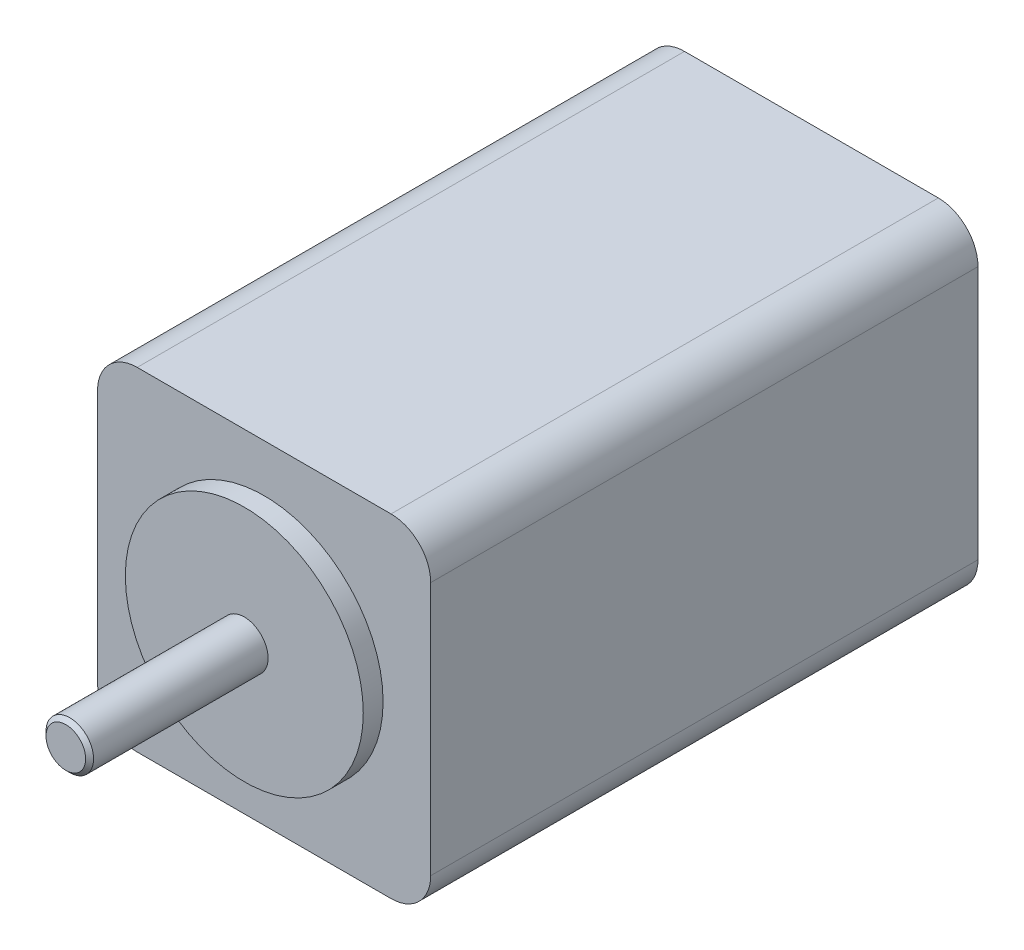
ISO-10303-21;
HEADER;
FILE_DESCRIPTION(('STEP AP214'),'2;1');
FILE_NAME('part.step','',(''),(''),'','','');
FILE_SCHEMA(('AUTOMOTIVE_DESIGN { 1 0 10303 214 1 1 1 1 }'));
ENDSEC;
DATA;
#1=APPLICATION_CONTEXT('core data for automotive mechanical design processes');
#2=APPLICATION_PROTOCOL_DEFINITION('international standard','automotive_design',2000,#1);
#3=PRODUCT_CONTEXT('',#1,'mechanical');
#4=PRODUCT('Part','Part','',(#3));
#5=PRODUCT_RELATED_PRODUCT_CATEGORY('part','',(#4));
#6=PRODUCT_DEFINITION_FORMATION('','',#4);
#7=PRODUCT_DEFINITION_CONTEXT('part definition',#1,'design');
#8=PRODUCT_DEFINITION('design','',#6,#7);
#9=PRODUCT_DEFINITION_SHAPE('','',#8);
#10=(LENGTH_UNIT() NAMED_UNIT(*) SI_UNIT(.MILLI.,.METRE.));
#11=(NAMED_UNIT(*) PLANE_ANGLE_UNIT() SI_UNIT($,.RADIAN.));
#12=(NAMED_UNIT(*) SI_UNIT($,.STERADIAN.) SOLID_ANGLE_UNIT());
#13=UNCERTAINTY_MEASURE_WITH_UNIT(LENGTH_MEASURE(1.E-05),#10,'distance_accuracy_value','');
#14=(GEOMETRIC_REPRESENTATION_CONTEXT(3) GLOBAL_UNCERTAINTY_ASSIGNED_CONTEXT((#13)) GLOBAL_UNIT_ASSIGNED_CONTEXT((#10,
#11,#12)) REPRESENTATION_CONTEXT('',''));
#15=CARTESIAN_POINT('',(0.,0.,0.));
#16=DIRECTION('',(0.,0.,1.));
#17=DIRECTION('',(1.,0.,0.));
#18=AXIS2_PLACEMENT_3D('',#15,#16,#17);
#19=CARTESIAN_POINT('',(0.,0.,7.5));
#20=DIRECTION('',(0.,0.,1.));
#21=DIRECTION('',(1.,0.,0.));
#22=AXIS2_PLACEMENT_3D('',#19,#20,#21);
#23=PLANE('',#22);
#24=CARTESIAN_POINT('',(0.,0.,7.5));
#25=DIRECTION('',(0.,0.,1.));
#26=DIRECTION('',(1.,0.,0.));
#27=AXIS2_PLACEMENT_3D('',#24,#25,#26);
#28=CIRCLE('',#27,15.);
#29=CARTESIAN_POINT('',(15.,0.,7.5));
#30=VERTEX_POINT('',#29);
#31=EDGE_CURVE('E147',#30,#30,#28,.T.);
#32=ORIENTED_EDGE('',*,*,#31,.T.);
#33=EDGE_LOOP('',(#32));
#34=FACE_BOUND('',#33,.T.);
#35=CARTESIAN_POINT('',(0.,0.,7.5));
#36=DIRECTION('',(0.,0.,1.));
#37=DIRECTION('',(1.,0.,0.));
#38=AXIS2_PLACEMENT_3D('',#35,#36,#37);
#39=CIRCLE('',#38,3.);
#40=CARTESIAN_POINT('',(-3.,0.,7.5));
#41=VERTEX_POINT('',#40);
#42=EDGE_CURVE('E143',#41,#41,#39,.T.);
#43=ORIENTED_EDGE('',*,*,#42,.F.);
#44=EDGE_LOOP('',(#43));
#45=FACE_BOUND('',#44,.T.);
#46=ADVANCED_FACE('F35',(#34,#45),#23,.T.);
#47=CARTESIAN_POINT('',(0.,0.,5.));
#48=DIRECTION('',(0.,0.,1.));
#49=DIRECTION('',(1.,0.,0.));
#50=AXIS2_PLACEMENT_3D('',#47,#48,#49);
#51=PLANE('',#50);
#52=DIRECTION('',(1.,0.,0.));
#53=VECTOR('',#52,1.);
#54=CARTESIAN_POINT('',(-21.,-21.,5.));
#55=LINE('',#54,#53);
#56=CARTESIAN_POINT('',(-16.,-21.,5.));
#57=VERTEX_POINT('',#56);
#58=CARTESIAN_POINT('',(16.,-21.,5.));
#59=VERTEX_POINT('',#58);
#60=EDGE_CURVE('E159',#57,#59,#55,.T.);
#61=ORIENTED_EDGE('',*,*,#60,.T.);
#62=CARTESIAN_POINT('',(16.,-16.,5.));
#63=DIRECTION('',(0.,0.,1.));
#64=DIRECTION('',(1.,0.,0.));
#65=AXIS2_PLACEMENT_3D('',#62,#63,#64);
#66=CIRCLE('',#65,5.);
#67=CARTESIAN_POINT('',(21.,-16.,5.));
#68=VERTEX_POINT('',#67);
#69=EDGE_CURVE('E107',#59,#68,#66,.T.);
#70=ORIENTED_EDGE('',*,*,#69,.T.);
#71=DIRECTION('',(0.,1.,0.));
#72=VECTOR('',#71,1.);
#73=CARTESIAN_POINT('',(21.,21.,5.));
#74=LINE('',#73,#72);
#75=CARTESIAN_POINT('',(21.,16.,5.));
#76=VERTEX_POINT('',#75);
#77=EDGE_CURVE('E150',#68,#76,#74,.T.);
#78=ORIENTED_EDGE('',*,*,#77,.T.);
#79=CARTESIAN_POINT('',(16.,16.,5.));
#80=DIRECTION('',(0.,0.,1.));
#81=DIRECTION('',(1.,0.,0.));
#82=AXIS2_PLACEMENT_3D('',#79,#80,#81);
#83=CIRCLE('',#82,5.);
#84=CARTESIAN_POINT('',(16.,21.,5.));
#85=VERTEX_POINT('',#84);
#86=EDGE_CURVE('E111',#76,#85,#83,.T.);
#87=ORIENTED_EDGE('',*,*,#86,.T.);
#88=DIRECTION('',(-1.,0.,0.));
#89=VECTOR('',#88,1.);
#90=CARTESIAN_POINT('',(-21.,21.,5.));
#91=LINE('',#90,#89);
#92=CARTESIAN_POINT('',(-16.,21.,5.));
#93=VERTEX_POINT('',#92);
#94=EDGE_CURVE('E155',#85,#93,#91,.T.);
#95=ORIENTED_EDGE('',*,*,#94,.T.);
#96=CARTESIAN_POINT('',(-16.,16.,5.));
#97=DIRECTION('',(0.,0.,1.));
#98=DIRECTION('',(1.,0.,0.));
#99=AXIS2_PLACEMENT_3D('',#96,#97,#98);
#100=CIRCLE('',#99,5.);
#101=CARTESIAN_POINT('',(-21.,16.,5.));
#102=VERTEX_POINT('',#101);
#103=EDGE_CURVE('E57',#93,#102,#100,.T.);
#104=ORIENTED_EDGE('',*,*,#103,.T.);
#105=DIRECTION('',(0.,-1.,0.));
#106=VECTOR('',#105,1.);
#107=CARTESIAN_POINT('',(-21.,21.,5.));
#108=LINE('',#107,#106);
#109=CARTESIAN_POINT('',(-21.,-16.,5.));
#110=VERTEX_POINT('',#109);
#111=EDGE_CURVE('E157',#102,#110,#108,.T.);
#112=ORIENTED_EDGE('',*,*,#111,.T.);
#113=CARTESIAN_POINT('',(-16.,-16.,5.));
#114=DIRECTION('',(0.,0.,1.));
#115=DIRECTION('',(1.,0.,0.));
#116=AXIS2_PLACEMENT_3D('',#113,#114,#115);
#117=CIRCLE('',#116,5.);
#118=EDGE_CURVE('E168',#110,#57,#117,.T.);
#119=ORIENTED_EDGE('',*,*,#118,.T.);
#120=EDGE_LOOP('',(#61,#70,#78,#87,#95,#104,#112,#119));
#121=FACE_BOUND('',#120,.T.);
#122=CARTESIAN_POINT('',(0.,0.,5.));
#123=DIRECTION('',(0.,0.,1.));
#124=DIRECTION('',(1.,0.,0.));
#125=AXIS2_PLACEMENT_3D('',#122,#123,#124);
#126=CIRCLE('',#125,15.);
#127=CARTESIAN_POINT('',(15.,0.,5.));
#128=VERTEX_POINT('',#127);
#129=EDGE_CURVE('E146',#128,#128,#126,.T.);
#130=ORIENTED_EDGE('',*,*,#129,.F.);
#131=EDGE_LOOP('',(#130));
#132=FACE_BOUND('',#131,.T.);
#133=ADVANCED_FACE('F190',(#121,#132),#51,.T.);
#134=CARTESIAN_POINT('',(21.,21.,5.));
#135=DIRECTION('',(-1.,0.,0.));
#136=DIRECTION('',(0.,-1.,0.));
#137=AXIS2_PLACEMENT_3D('',#134,#135,#136);
#138=PLANE('',#137);
#139=ORIENTED_EDGE('',*,*,#77,.F.);
#140=DIRECTION('',(0.,0.,-1.));
#141=VECTOR('',#140,1.);
#142=CARTESIAN_POINT('',(21.,-16.,5.));
#143=LINE('',#142,#141);
#144=CARTESIAN_POINT('',(21.,-16.,-64.));
#145=VERTEX_POINT('',#144);
#146=EDGE_CURVE('E163',#68,#145,#143,.T.);
#147=ORIENTED_EDGE('',*,*,#146,.T.);
#148=DIRECTION('',(0.,-1.,0.));
#149=VECTOR('',#148,1.);
#150=CARTESIAN_POINT('',(21.,-16.,-64.));
#151=LINE('',#150,#149);
#152=CARTESIAN_POINT('',(21.,16.,-64.));
#153=VERTEX_POINT('',#152);
#154=EDGE_CURVE('E127',#153,#145,#151,.T.);
#155=ORIENTED_EDGE('',*,*,#154,.F.);
#156=DIRECTION('',(0.,0.,-1.));
#157=VECTOR('',#156,1.);
#158=CARTESIAN_POINT('',(21.,16.,5.));
#159=LINE('',#158,#157);
#160=EDGE_CURVE('E161',#153,#76,#159,.F.);
#161=ORIENTED_EDGE('',*,*,#160,.T.);
#162=EDGE_LOOP('',(#139,#147,#155,#161));
#163=FACE_BOUND('',#162,.T.);
#164=ADVANCED_FACE('F196',(#163),#138,.F.);
#165=CARTESIAN_POINT('',(-21.,21.,5.));
#166=DIRECTION('',(0.,-1.,0.));
#167=DIRECTION('',(0.,0.,-1.));
#168=AXIS2_PLACEMENT_3D('',#165,#166,#167);
#169=PLANE('',#168);
#170=DIRECTION('',(0.,0.,-1.));
#171=VECTOR('',#170,1.);
#172=CARTESIAN_POINT('',(16.,21.,5.));
#173=LINE('',#172,#171);
#174=CARTESIAN_POINT('',(16.,21.,-64.));
#175=VERTEX_POINT('',#174);
#176=EDGE_CURVE('E174',#85,#175,#173,.T.);
#177=ORIENTED_EDGE('',*,*,#176,.T.);
#178=DIRECTION('',(1.,0.,0.));
#179=VECTOR('',#178,1.);
#180=CARTESIAN_POINT('',(16.,21.,-64.));
#181=LINE('',#180,#179);
#182=CARTESIAN_POINT('',(-16.,21.,-64.));
#183=VERTEX_POINT('',#182);
#184=EDGE_CURVE('E137',#183,#175,#181,.T.);
#185=ORIENTED_EDGE('',*,*,#184,.F.);
#186=DIRECTION('',(0.,0.,-1.));
#187=VECTOR('',#186,1.);
#188=CARTESIAN_POINT('',(-16.,21.,5.));
#189=LINE('',#188,#187);
#190=EDGE_CURVE('E176',#183,#93,#189,.F.);
#191=ORIENTED_EDGE('',*,*,#190,.T.);
#192=ORIENTED_EDGE('',*,*,#94,.F.);
#193=EDGE_LOOP('',(#177,#185,#191,#192));
#194=FACE_BOUND('',#193,.T.);
#195=ADVANCED_FACE('F213',(#194),#169,.F.);
#196=CARTESIAN_POINT('',(-21.,21.,5.));
#197=DIRECTION('',(1.,0.,0.));
#198=DIRECTION('',(0.,1.,0.));
#199=AXIS2_PLACEMENT_3D('',#196,#197,#198);
#200=PLANE('',#199);
#201=DIRECTION('',(0.,0.,-1.));
#202=VECTOR('',#201,1.);
#203=CARTESIAN_POINT('',(-21.,16.,5.));
#204=LINE('',#203,#202);
#205=CARTESIAN_POINT('',(-21.,16.,-64.));
#206=VERTEX_POINT('',#205);
#207=EDGE_CURVE('E171',#102,#206,#204,.T.);
#208=ORIENTED_EDGE('',*,*,#207,.T.);
#209=DIRECTION('',(0.,1.,0.));
#210=VECTOR('',#209,1.);
#211=CARTESIAN_POINT('',(-21.,16.,-64.));
#212=LINE('',#211,#210);
#213=CARTESIAN_POINT('',(-21.,-16.,-64.));
#214=VERTEX_POINT('',#213);
#215=EDGE_CURVE('E131',#214,#206,#212,.T.);
#216=ORIENTED_EDGE('',*,*,#215,.F.);
#217=DIRECTION('',(0.,0.,-1.));
#218=VECTOR('',#217,1.);
#219=CARTESIAN_POINT('',(-21.,-16.,5.));
#220=LINE('',#219,#218);
#221=EDGE_CURVE('E50',#214,#110,#220,.F.);
#222=ORIENTED_EDGE('',*,*,#221,.T.);
#223=ORIENTED_EDGE('',*,*,#111,.F.);
#224=EDGE_LOOP('',(#208,#216,#222,#223));
#225=FACE_BOUND('',#224,.T.);
#226=ADVANCED_FACE('F210',(#225),#200,.F.);
#227=CARTESIAN_POINT('',(-21.,-21.,5.));
#228=DIRECTION('',(0.,1.,0.));
#229=DIRECTION('',(0.,0.,1.));
#230=AXIS2_PLACEMENT_3D('',#227,#228,#229);
#231=PLANE('',#230);
#232=DIRECTION('',(0.,0.,-1.));
#233=VECTOR('',#232,1.);
#234=CARTESIAN_POINT('',(-16.,-21.,5.));
#235=LINE('',#234,#233);
#236=CARTESIAN_POINT('',(-16.,-21.,-64.));
#237=VERTEX_POINT('',#236);
#238=EDGE_CURVE('E112',#57,#237,#235,.T.);
#239=ORIENTED_EDGE('',*,*,#238,.T.);
#240=DIRECTION('',(-1.,0.,0.));
#241=VECTOR('',#240,1.);
#242=CARTESIAN_POINT('',(-16.,-21.,-64.));
#243=LINE('',#242,#241);
#244=CARTESIAN_POINT('',(16.,-21.,-64.));
#245=VERTEX_POINT('',#244);
#246=EDGE_CURVE('E115',#245,#237,#243,.T.);
#247=ORIENTED_EDGE('',*,*,#246,.F.);
#248=DIRECTION('',(0.,0.,-1.));
#249=VECTOR('',#248,1.);
#250=CARTESIAN_POINT('',(16.,-21.,5.));
#251=LINE('',#250,#249);
#252=EDGE_CURVE('E101',#245,#59,#251,.F.);
#253=ORIENTED_EDGE('',*,*,#252,.T.);
#254=ORIENTED_EDGE('',*,*,#60,.F.);
#255=EDGE_LOOP('',(#239,#247,#253,#254));
#256=FACE_BOUND('',#255,.T.);
#257=ADVANCED_FACE('F116',(#256),#231,.F.);
#258=CARTESIAN_POINT('',(16.,-16.,5.));
#259=DIRECTION('',(0.,0.,-1.));
#260=DIRECTION('',(-1.,0.,0.));
#261=AXIS2_PLACEMENT_3D('',#258,#259,#260);
#262=CYLINDRICAL_SURFACE('',#261,5.);
#263=ORIENTED_EDGE('',*,*,#69,.F.);
#264=ORIENTED_EDGE('',*,*,#252,.F.);
#265=CARTESIAN_POINT('',(16.,-16.,-64.));
#266=DIRECTION('',(0.,0.,-1.));
#267=DIRECTION('',(-1.,0.,0.));
#268=AXIS2_PLACEMENT_3D('',#265,#266,#267);
#269=CIRCLE('',#268,5.);
#270=EDGE_CURVE('E106',#145,#245,#269,.T.);
#271=ORIENTED_EDGE('',*,*,#270,.F.);
#272=ORIENTED_EDGE('',*,*,#146,.F.);
#273=EDGE_LOOP('',(#263,#264,#271,#272));
#274=FACE_BOUND('',#273,.T.);
#275=ADVANCED_FACE('F103',(#274),#262,.T.);
#276=CARTESIAN_POINT('',(-16.,-16.,5.));
#277=DIRECTION('',(0.,0.,-1.));
#278=DIRECTION('',(-1.,0.,0.));
#279=AXIS2_PLACEMENT_3D('',#276,#277,#278);
#280=CYLINDRICAL_SURFACE('',#279,5.);
#281=ORIENTED_EDGE('',*,*,#118,.F.);
#282=ORIENTED_EDGE('',*,*,#221,.F.);
#283=CARTESIAN_POINT('',(-16.,-16.,-64.));
#284=DIRECTION('',(0.,0.,-1.));
#285=DIRECTION('',(-1.,0.,0.));
#286=AXIS2_PLACEMENT_3D('',#283,#284,#285);
#287=CIRCLE('',#286,5.);
#288=EDGE_CURVE('E121',#237,#214,#287,.T.);
#289=ORIENTED_EDGE('',*,*,#288,.F.);
#290=ORIENTED_EDGE('',*,*,#238,.F.);
#291=EDGE_LOOP('',(#281,#282,#289,#290));
#292=FACE_BOUND('',#291,.T.);
#293=ADVANCED_FACE('F222',(#292),#280,.T.);
#294=CARTESIAN_POINT('',(-16.,16.,5.));
#295=DIRECTION('',(0.,0.,-1.));
#296=DIRECTION('',(-1.,0.,0.));
#297=AXIS2_PLACEMENT_3D('',#294,#295,#296);
#298=CYLINDRICAL_SURFACE('',#297,5.);
#299=ORIENTED_EDGE('',*,*,#103,.F.);
#300=ORIENTED_EDGE('',*,*,#190,.F.);
#301=CARTESIAN_POINT('',(-16.,16.,-64.));
#302=DIRECTION('',(0.,0.,-1.));
#303=DIRECTION('',(-1.,0.,0.));
#304=AXIS2_PLACEMENT_3D('',#301,#302,#303);
#305=CIRCLE('',#304,5.);
#306=EDGE_CURVE('E134',#206,#183,#305,.T.);
#307=ORIENTED_EDGE('',*,*,#306,.F.);
#308=ORIENTED_EDGE('',*,*,#207,.F.);
#309=EDGE_LOOP('',(#299,#300,#307,#308));
#310=FACE_BOUND('',#309,.T.);
#311=ADVANCED_FACE('F225',(#310),#298,.T.);
#312=CARTESIAN_POINT('',(16.,16.,5.));
#313=DIRECTION('',(0.,0.,-1.));
#314=DIRECTION('',(-1.,0.,0.));
#315=AXIS2_PLACEMENT_3D('',#312,#313,#314);
#316=CYLINDRICAL_SURFACE('',#315,5.);
#317=ORIENTED_EDGE('',*,*,#86,.F.);
#318=ORIENTED_EDGE('',*,*,#160,.F.);
#319=CARTESIAN_POINT('',(16.,16.,-64.));
#320=DIRECTION('',(0.,0.,-1.));
#321=DIRECTION('',(-1.,0.,0.));
#322=AXIS2_PLACEMENT_3D('',#319,#320,#321);
#323=CIRCLE('',#322,5.);
#324=EDGE_CURVE('E140',#175,#153,#323,.T.);
#325=ORIENTED_EDGE('',*,*,#324,.F.);
#326=ORIENTED_EDGE('',*,*,#176,.F.);
#327=EDGE_LOOP('',(#317,#318,#325,#326));
#328=FACE_BOUND('',#327,.T.);
#329=ADVANCED_FACE('F205',(#328),#316,.T.);
#330=CARTESIAN_POINT('',(0.,0.,7.5));
#331=DIRECTION('',(0.,0.,-1.));
#332=DIRECTION('',(-1.,0.,0.));
#333=AXIS2_PLACEMENT_3D('',#330,#331,#332);
#334=CYLINDRICAL_SURFACE('',#333,15.);
#335=ORIENTED_EDGE('',*,*,#31,.F.);
#336=EDGE_LOOP('',(#335));
#337=FACE_BOUND('',#336,.T.);
#338=ORIENTED_EDGE('',*,*,#129,.T.);
#339=EDGE_LOOP('',(#338));
#340=FACE_BOUND('',#339,.T.);
#341=ADVANCED_FACE('F203',(#337,#340),#334,.T.);
#342=CARTESIAN_POINT('',(0.,0.,30.));
#343=DIRECTION('',(0.,0.,-1.));
#344=DIRECTION('',(-1.,0.,0.));
#345=AXIS2_PLACEMENT_3D('',#342,#343,#344);
#346=CYLINDRICAL_SURFACE('',#345,3.);
#347=CARTESIAN_POINT('',(0.,0.,29.5));
#348=DIRECTION('',(0.,0.,1.));
#349=DIRECTION('',(1.,0.,0.));
#350=AXIS2_PLACEMENT_3D('',#347,#348,#349);
#351=CIRCLE('',#350,3.);
#352=CARTESIAN_POINT('',(-3.,0.,29.5));
#353=VERTEX_POINT('',#352);
#354=EDGE_CURVE('E11',#353,#353,#351,.F.);
#355=CARTESIAN_POINT('',(-3.,0.,29.5));
#356=CARTESIAN_POINT('',(-3.,0.,29.2708333333334));
#357=CARTESIAN_POINT('',(-3.,0.,29.0416666666667));
#358=CARTESIAN_POINT('',(-3.,0.,28.5833333333334));
#359=CARTESIAN_POINT('',(-3.,0.,28.3541666666667));
#360=CARTESIAN_POINT('',(-3.,0.,27.8958333333334));
#361=CARTESIAN_POINT('',(-3.,0.,27.6666666666667));
#362=CARTESIAN_POINT('',(-3.,0.,27.2083333333334));
#363=CARTESIAN_POINT('',(-3.,0.,26.9791666666667));
#364=CARTESIAN_POINT('',(-3.,0.,26.5208333333334));
#365=CARTESIAN_POINT('',(-3.,0.,26.2916666666667));
#366=CARTESIAN_POINT('',(-3.,0.,25.8333333333334));
#367=CARTESIAN_POINT('',(-3.,0.,25.6041666666667));
#368=CARTESIAN_POINT('',(-3.,0.,25.1458333333334));
#369=CARTESIAN_POINT('',(-3.,0.,24.9166666666667));
#370=CARTESIAN_POINT('',(-3.,0.,24.4583333333334));
#371=CARTESIAN_POINT('',(-3.,0.,24.2291666666667));
#372=CARTESIAN_POINT('',(-3.,0.,23.7708333333334));
#373=CARTESIAN_POINT('',(-3.,0.,23.5416666666667));
#374=CARTESIAN_POINT('',(-3.,0.,23.0833333333334));
#375=CARTESIAN_POINT('',(-3.,0.,22.8541666666667));
#376=CARTESIAN_POINT('',(-3.,0.,22.3958333333334));
#377=CARTESIAN_POINT('',(-3.,0.,22.1666666666667));
#378=CARTESIAN_POINT('',(-3.,0.,21.7083333333334));
#379=CARTESIAN_POINT('',(-3.,0.,21.4791666666667));
#380=CARTESIAN_POINT('',(-3.,0.,21.0208333333334));
#381=CARTESIAN_POINT('',(-3.,0.,20.7916666666667));
#382=CARTESIAN_POINT('',(-3.,0.,20.3333333333334));
#383=CARTESIAN_POINT('',(-3.,0.,20.1041666666667));
#384=CARTESIAN_POINT('',(-3.,0.,19.6458333333334));
#385=CARTESIAN_POINT('',(-3.,0.,19.4166666666667));
#386=CARTESIAN_POINT('',(-3.,0.,18.9583333333334));
#387=CARTESIAN_POINT('',(-3.,0.,18.7291666666667));
#388=CARTESIAN_POINT('',(-3.,0.,18.2708333333334));
#389=CARTESIAN_POINT('',(-3.,0.,18.0416666666667));
#390=CARTESIAN_POINT('',(-3.,0.,17.5833333333334));
#391=CARTESIAN_POINT('',(-3.,0.,17.3541666666667));
#392=CARTESIAN_POINT('',(-3.,0.,16.8958333333333));
#393=CARTESIAN_POINT('',(-3.,0.,16.6666666666667));
#394=CARTESIAN_POINT('',(-3.,0.,16.2083333333333));
#395=CARTESIAN_POINT('',(-3.,0.,15.9791666666667));
#396=CARTESIAN_POINT('',(-3.,0.,15.5208333333333));
#397=CARTESIAN_POINT('',(-3.,0.,15.2916666666667));
#398=CARTESIAN_POINT('',(-3.,0.,14.8333333333333));
#399=CARTESIAN_POINT('',(-3.,0.,14.6041666666667));
#400=CARTESIAN_POINT('',(-3.,0.,14.1458333333333));
#401=CARTESIAN_POINT('',(-3.,0.,13.9166666666667));
#402=CARTESIAN_POINT('',(-3.,0.,13.4583333333333));
#403=CARTESIAN_POINT('',(-3.,0.,13.2291666666667));
#404=CARTESIAN_POINT('',(-3.,0.,12.7708333333333));
#405=CARTESIAN_POINT('',(-3.,0.,12.5416666666667));
#406=CARTESIAN_POINT('',(-3.,0.,12.0833333333333));
#407=CARTESIAN_POINT('',(-3.,0.,11.8541666666667));
#408=CARTESIAN_POINT('',(-3.,0.,11.3958333333333));
#409=CARTESIAN_POINT('',(-3.,0.,11.1666666666667));
#410=CARTESIAN_POINT('',(-3.,0.,10.7083333333333));
#411=CARTESIAN_POINT('',(-3.,0.,10.4791666666667));
#412=CARTESIAN_POINT('',(-3.,0.,10.0208333333333));
#413=CARTESIAN_POINT('',(-3.,0.,9.79166666666667));
#414=CARTESIAN_POINT('',(-3.,0.,9.33333333333333));
#415=CARTESIAN_POINT('',(-3.,0.,9.10416666666667));
#416=CARTESIAN_POINT('',(-3.,0.,8.64583333333333));
#417=CARTESIAN_POINT('',(-3.,0.,8.41666666666666));
#418=CARTESIAN_POINT('',(-3.,0.,7.95833333333333));
#419=CARTESIAN_POINT('',(-3.,0.,7.72916666666666));
#420=CARTESIAN_POINT('',(-3.,0.,7.5));
#421=B_SPLINE_CURVE_WITH_KNOTS('',3,(#355,#356,#357,#358,#359,#360,#361,#362,#363,#364,#365,
#366,#367,#368,#369,#370,#371,#372,#373,#374,#375,#376,#377,#378,#379,#380,#381,#382,#383,#384,
#385,#386,#387,#388,#389,#390,#391,#392,#393,#394,#395,#396,#397,#398,#399,#400,#401,#402,#403,
#404,#405,#406,#407,#408,#409,#410,#411,#412,#413,#414,#415,#416,#417,#418,#419,#420),
.UNSPECIFIED.,.F.,.F.,(4,2,2,2,2,2,2,2,2,2,2,2,2,2,2,2,2,2,2,2,2,2,2,2,2,2,2,2,2,2,2,2,4),(0.,
0.687500000000001,1.375,2.0625,2.75000000000001,3.43750000000001,4.12500000000001,
4.81250000000001,5.50000000000001,6.18750000000001,6.87500000000001,7.56250000000001,
8.25000000000002,8.93750000000002,9.62500000000002,10.3125,11.,11.6875,12.375,13.0625,13.75,
14.4375,15.125,15.8125,16.5,17.1875,17.875,18.5625,19.25,19.9375,20.625,21.3125,22.),.UNSPECIFIED.);
#422=EDGE_CURVE('BSEAM201',#353,#41,#421,.T.);
#423=ORIENTED_EDGE('',*,*,#354,.T.);
#424=ORIENTED_EDGE('',*,*,#42,.T.);
#425=ORIENTED_EDGE('',*,*,#422,.T.);
#426=ORIENTED_EDGE('',*,*,#422,.F.);
#427=EDGE_LOOP('',(#423,#425,#424,#426));
#428=FACE_BOUND('',#427,.T.);
#429=ADVANCED_FACE('F201',(#428),#346,.T.);
#430=CARTESIAN_POINT('',(0.,0.,30.));
#431=DIRECTION('',(0.,0.,1.));
#432=DIRECTION('',(1.,0.,0.));
#433=AXIS2_PLACEMENT_3D('',#430,#431,#432);
#434=PLANE('',#433);
#435=CARTESIAN_POINT('',(0.,0.,30.));
#436=DIRECTION('',(0.,0.,1.));
#437=DIRECTION('',(1.,0.,0.));
#438=AXIS2_PLACEMENT_3D('',#435,#436,#437);
#439=CIRCLE('',#438,2.50000000000006);
#440=CARTESIAN_POINT('',(2.50000000000006,0.,30.));
#441=VERTEX_POINT('',#440);
#442=EDGE_CURVE('E43',#441,#441,#439,.T.);
#443=ORIENTED_EDGE('',*,*,#442,.T.);
#444=EDGE_LOOP('',(#443));
#445=FACE_BOUND('',#444,.T.);
#446=ADVANCED_FACE('F180',(#445),#434,.T.);
#447=CARTESIAN_POINT('',(16.,-16.,-64.));
#448=DIRECTION('',(0.,0.,-1.));
#449=DIRECTION('',(-1.,0.,0.));
#450=AXIS2_PLACEMENT_3D('',#447,#448,#449);
#451=PLANE('',#450);
#452=ORIENTED_EDGE('',*,*,#270,.T.);
#453=ORIENTED_EDGE('',*,*,#246,.T.);
#454=ORIENTED_EDGE('',*,*,#288,.T.);
#455=ORIENTED_EDGE('',*,*,#215,.T.);
#456=ORIENTED_EDGE('',*,*,#306,.T.);
#457=ORIENTED_EDGE('',*,*,#184,.T.);
#458=ORIENTED_EDGE('',*,*,#324,.T.);
#459=ORIENTED_EDGE('',*,*,#154,.T.);
#460=EDGE_LOOP('',(#452,#453,#454,#455,#456,#457,#458,#459));
#461=FACE_BOUND('',#460,.T.);
#462=ADVANCED_FACE('F124',(#461),#451,.T.);
#463=CARTESIAN_POINT('',(0.,0.,30.));
#464=DIRECTION('',(0.,0.,-1.));
#465=DIRECTION('',(-1.,0.,0.));
#466=AXIS2_PLACEMENT_3D('',#463,#464,#465);
#467=CONICAL_SURFACE('',#466,2.50000000000006,0.78539816339744);
#468=ORIENTED_EDGE('',*,*,#354,.F.);
#469=EDGE_LOOP('',(#468));
#470=FACE_BOUND('',#469,.T.);
#471=ORIENTED_EDGE('',*,*,#442,.F.);
#472=EDGE_LOOP('',(#471));
#473=FACE_BOUND('',#472,.T.);
#474=ADVANCED_FACE('F37',(#470,#473),#467,.T.);
#475=CLOSED_SHELL('',(#46,#133,#164,#195,#226,#257,#275,#293,#311,#329,#341,#429,#446,#462,#474));
#476=MANIFOLD_SOLID_BREP('B2',#475);
#477=ADVANCED_BREP_SHAPE_REPRESENTATION('',(#18,#476),#14);
#478=SHAPE_DEFINITION_REPRESENTATION(#9,#477);
ENDSEC;
END-ISO-10303-21;
